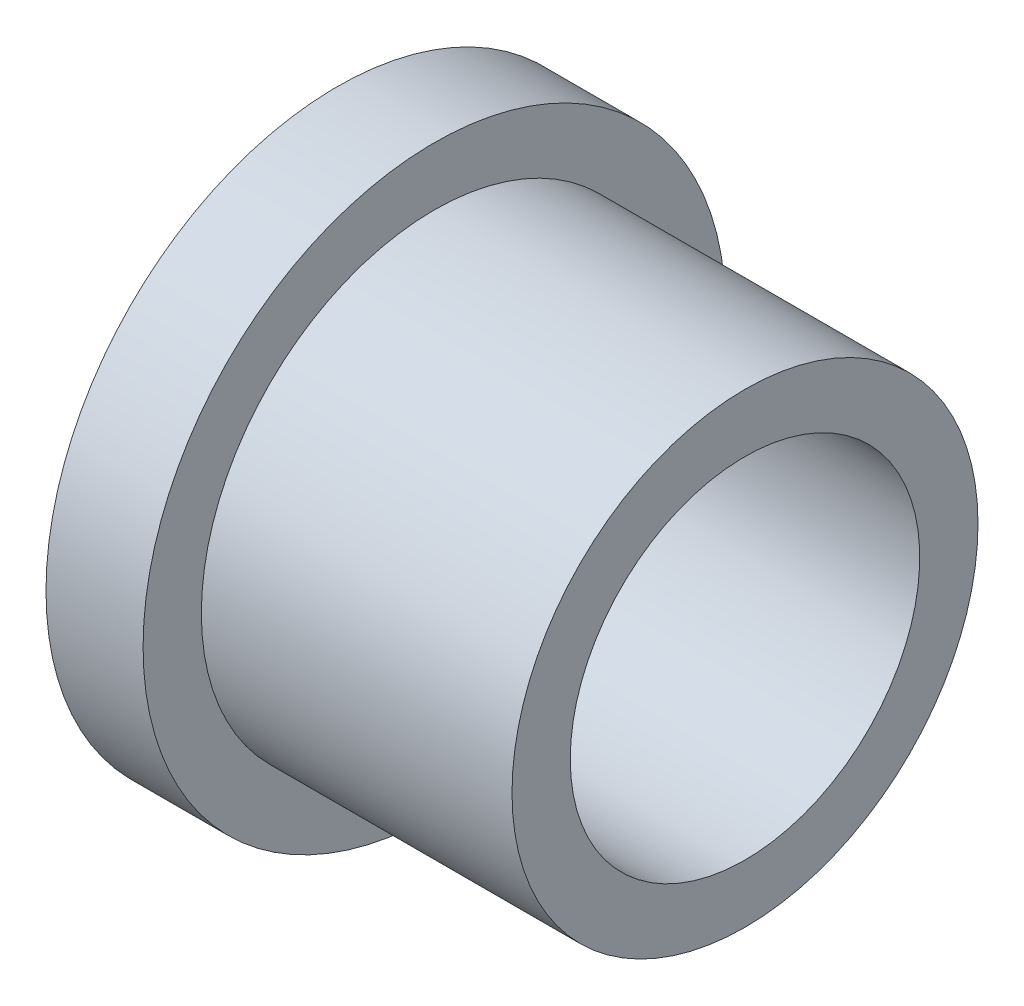
ISO-10303-21;
HEADER;
FILE_DESCRIPTION(('STEP AP214'),'2;1');
FILE_NAME('part.step','',(''),(''),'','','');
FILE_SCHEMA(('AUTOMOTIVE_DESIGN { 1 0 10303 214 1 1 1 1 }'));
ENDSEC;
DATA;
#1=APPLICATION_CONTEXT('core data for automotive mechanical design processes');
#2=APPLICATION_PROTOCOL_DEFINITION('international standard','automotive_design',2000,#1);
#3=PRODUCT_CONTEXT('',#1,'mechanical');
#4=PRODUCT('Part','Part','',(#3));
#5=PRODUCT_RELATED_PRODUCT_CATEGORY('part','',(#4));
#6=PRODUCT_DEFINITION_FORMATION('','',#4);
#7=PRODUCT_DEFINITION_CONTEXT('part definition',#1,'design');
#8=PRODUCT_DEFINITION('design','',#6,#7);
#9=PRODUCT_DEFINITION_SHAPE('','',#8);
#10=(LENGTH_UNIT() NAMED_UNIT(*) SI_UNIT(.MILLI.,.METRE.));
#11=(NAMED_UNIT(*) PLANE_ANGLE_UNIT() SI_UNIT($,.RADIAN.));
#12=(NAMED_UNIT(*) SI_UNIT($,.STERADIAN.) SOLID_ANGLE_UNIT());
#13=UNCERTAINTY_MEASURE_WITH_UNIT(LENGTH_MEASURE(1.E-05),#10,'distance_accuracy_value','');
#14=(GEOMETRIC_REPRESENTATION_CONTEXT(3) GLOBAL_UNCERTAINTY_ASSIGNED_CONTEXT((#13)) GLOBAL_UNIT_ASSIGNED_CONTEXT((#10,
#11,#12)) REPRESENTATION_CONTEXT('',''));
#15=CARTESIAN_POINT('',(0.,0.,0.));
#16=DIRECTION('',(0.,0.,1.));
#17=DIRECTION('',(1.,0.,0.));
#18=AXIS2_PLACEMENT_3D('',#15,#16,#17);
#19=CARTESIAN_POINT('',(0.,0.,0.));
#20=DIRECTION('',(-1.,0.,0.));
#21=DIRECTION('',(0.,0.,1.));
#22=AXIS2_PLACEMENT_3D('',#19,#20,#21);
#23=CYLINDRICAL_SURFACE('',#22,9.);
#24=CARTESIAN_POINT('',(0.,0.,0.));
#25=DIRECTION('',(-1.,0.,0.));
#26=DIRECTION('',(0.,0.,1.));
#27=AXIS2_PLACEMENT_3D('',#24,#25,#26);
#28=CIRCLE('',#27,9.);
#29=CARTESIAN_POINT('',(0.,0.,9.));
#30=VERTEX_POINT('',#29);
#31=EDGE_CURVE('E70',#30,#30,#28,.T.);
#32=ORIENTED_EDGE('',*,*,#31,.T.);
#33=EDGE_LOOP('',(#32));
#34=FACE_BOUND('',#33,.T.);
#35=CARTESIAN_POINT('',(21.,0.,0.));
#36=DIRECTION('',(-1.,0.,0.));
#37=DIRECTION('',(0.,0.,1.));
#38=AXIS2_PLACEMENT_3D('',#35,#36,#37);
#39=CIRCLE('',#38,9.);
#40=CARTESIAN_POINT('',(21.,0.,9.));
#41=VERTEX_POINT('',#40);
#42=EDGE_CURVE('E10',#41,#41,#39,.T.);
#43=ORIENTED_EDGE('',*,*,#42,.F.);
#44=EDGE_LOOP('',(#43));
#45=FACE_BOUND('',#44,.T.);
#46=ADVANCED_FACE('F43',(#34,#45),#23,.F.);
#47=CARTESIAN_POINT('',(21.,0.,0.));
#48=DIRECTION('',(1.,0.,0.));
#49=DIRECTION('',(0.,0.,-1.));
#50=AXIS2_PLACEMENT_3D('',#47,#48,#49);
#51=PLANE('',#50);
#52=ORIENTED_EDGE('',*,*,#42,.T.);
#53=EDGE_LOOP('',(#52));
#54=FACE_BOUND('',#53,.T.);
#55=CARTESIAN_POINT('',(21.,0.,0.));
#56=DIRECTION('',(-1.,0.,0.));
#57=DIRECTION('',(0.,0.,1.));
#58=AXIS2_PLACEMENT_3D('',#55,#56,#57);
#59=CIRCLE('',#58,12.);
#60=CARTESIAN_POINT('',(21.,0.,12.));
#61=VERTEX_POINT('',#60);
#62=EDGE_CURVE('E50',#61,#61,#59,.T.);
#63=ORIENTED_EDGE('',*,*,#62,.F.);
#64=EDGE_LOOP('',(#63));
#65=FACE_BOUND('',#64,.T.);
#66=ADVANCED_FACE('F89',(#54,#65),#51,.T.);
#67=CARTESIAN_POINT('',(0.,0.,0.));
#68=DIRECTION('',(-1.,0.,0.));
#69=DIRECTION('',(0.,0.,1.));
#70=AXIS2_PLACEMENT_3D('',#67,#68,#69);
#71=CYLINDRICAL_SURFACE('',#70,12.);
#72=ORIENTED_EDGE('',*,*,#62,.T.);
#73=EDGE_LOOP('',(#72));
#74=FACE_BOUND('',#73,.T.);
#75=CARTESIAN_POINT('',(5.,0.,0.));
#76=DIRECTION('',(-1.,0.,0.));
#77=DIRECTION('',(0.,0.,1.));
#78=AXIS2_PLACEMENT_3D('',#75,#76,#77);
#79=CIRCLE('',#78,12.);
#80=CARTESIAN_POINT('',(5.,0.,12.));
#81=VERTEX_POINT('',#80);
#82=EDGE_CURVE('E55',#81,#81,#79,.T.);
#83=ORIENTED_EDGE('',*,*,#82,.F.);
#84=EDGE_LOOP('',(#83));
#85=FACE_BOUND('',#84,.T.);
#86=ADVANCED_FACE('F93',(#74,#85),#71,.T.);
#87=CARTESIAN_POINT('',(5.,0.,0.));
#88=DIRECTION('',(1.,0.,0.));
#89=DIRECTION('',(0.,0.,-1.));
#90=AXIS2_PLACEMENT_3D('',#87,#88,#89);
#91=PLANE('',#90);
#92=ORIENTED_EDGE('',*,*,#82,.T.);
#93=EDGE_LOOP('',(#92));
#94=FACE_BOUND('',#93,.T.);
#95=CARTESIAN_POINT('',(5.,0.,0.));
#96=DIRECTION('',(-1.,0.,0.));
#97=DIRECTION('',(0.,0.,1.));
#98=AXIS2_PLACEMENT_3D('',#95,#96,#97);
#99=CIRCLE('',#98,15.);
#100=CARTESIAN_POINT('',(5.,0.,15.));
#101=VERTEX_POINT('',#100);
#102=EDGE_CURVE('E60',#101,#101,#99,.T.);
#103=ORIENTED_EDGE('',*,*,#102,.F.);
#104=EDGE_LOOP('',(#103));
#105=FACE_BOUND('',#104,.T.);
#106=ADVANCED_FACE('F85',(#94,#105),#91,.T.);
#107=CARTESIAN_POINT('',(0.,0.,0.));
#108=DIRECTION('',(-1.,0.,0.));
#109=DIRECTION('',(0.,0.,1.));
#110=AXIS2_PLACEMENT_3D('',#107,#108,#109);
#111=CYLINDRICAL_SURFACE('',#110,15.0000000000006);
#112=ORIENTED_EDGE('',*,*,#102,.T.);
#113=EDGE_LOOP('',(#112));
#114=FACE_BOUND('',#113,.T.);
#115=CARTESIAN_POINT('',(0.,0.,0.));
#116=DIRECTION('',(-1.,0.,0.));
#117=DIRECTION('',(0.,0.,1.));
#118=AXIS2_PLACEMENT_3D('',#115,#116,#117);
#119=CIRCLE('',#118,15.0000000000012);
#120=CARTESIAN_POINT('',(0.,0.,15.0000000000012));
#121=VERTEX_POINT('',#120);
#122=EDGE_CURVE('E66',#121,#121,#119,.T.);
#123=ORIENTED_EDGE('',*,*,#122,.F.);
#124=EDGE_LOOP('',(#123));
#125=FACE_BOUND('',#124,.T.);
#126=ADVANCED_FACE('F79',(#114,#125),#111,.T.);
#127=CARTESIAN_POINT('',(0.,0.,0.));
#128=DIRECTION('',(-1.,0.,0.));
#129=DIRECTION('',(0.,0.,1.));
#130=AXIS2_PLACEMENT_3D('',#127,#128,#129);
#131=PLANE('',#130);
#132=ORIENTED_EDGE('',*,*,#122,.T.);
#133=EDGE_LOOP('',(#132));
#134=FACE_BOUND('',#133,.T.);
#135=ORIENTED_EDGE('',*,*,#31,.F.);
#136=EDGE_LOOP('',(#135));
#137=FACE_BOUND('',#136,.T.);
#138=ADVANCED_FACE('F77',(#134,#137),#131,.T.);
#139=CLOSED_SHELL('',(#46,#66,#86,#106,#126,#138));
#140=MANIFOLD_SOLID_BREP('B2',#139);
#141=ADVANCED_BREP_SHAPE_REPRESENTATION('',(#18,#140),#14);
#142=SHAPE_DEFINITION_REPRESENTATION(#9,#141);
ENDSEC;
END-ISO-10303-21;
